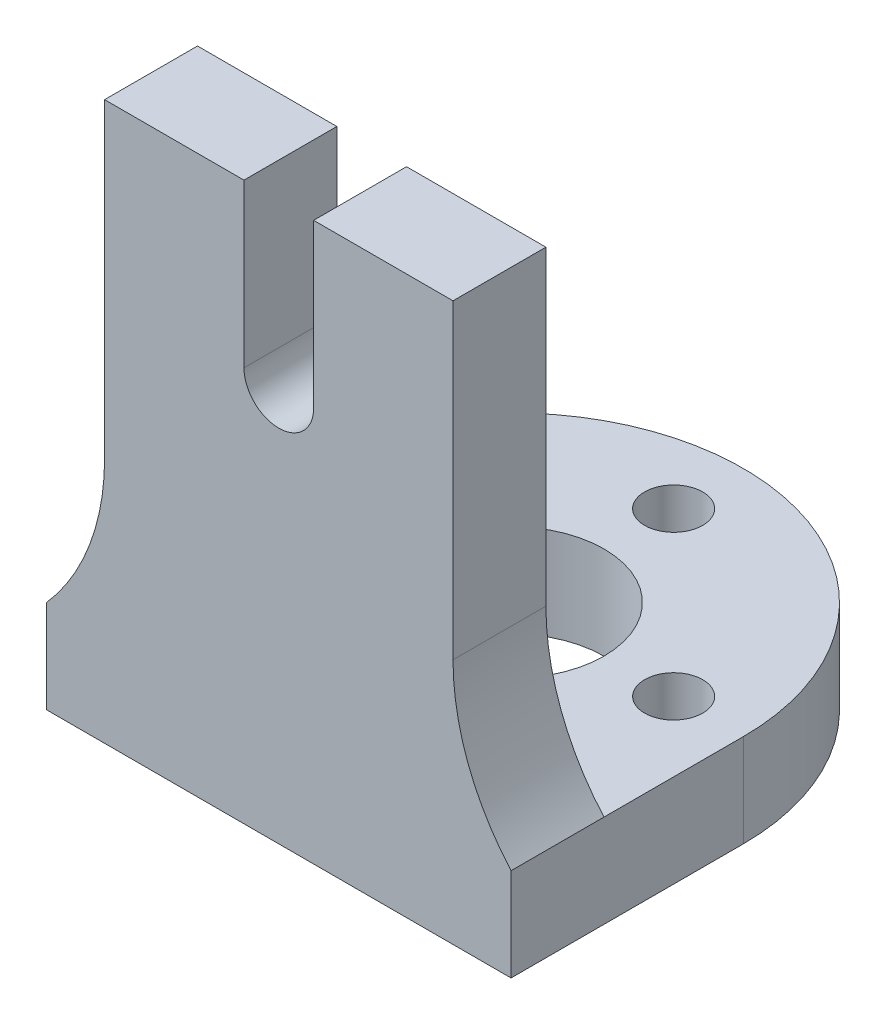
ISO-10303-21;
HEADER;
FILE_DESCRIPTION(('STEP AP214'),'2;1');
FILE_NAME('part.step','',(''),(''),'','','');
FILE_SCHEMA(('AUTOMOTIVE_DESIGN { 1 0 10303 214 1 1 1 1 }'));
ENDSEC;
DATA;
#1=APPLICATION_CONTEXT('core data for automotive mechanical design processes');
#2=APPLICATION_PROTOCOL_DEFINITION('international standard','automotive_design',2000,#1);
#3=PRODUCT_CONTEXT('',#1,'mechanical');
#4=PRODUCT('Part','Part','',(#3));
#5=PRODUCT_RELATED_PRODUCT_CATEGORY('part','',(#4));
#6=PRODUCT_DEFINITION_FORMATION('','',#4);
#7=PRODUCT_DEFINITION_CONTEXT('part definition',#1,'design');
#8=PRODUCT_DEFINITION('design','',#6,#7);
#9=PRODUCT_DEFINITION_SHAPE('','',#8);
#10=(LENGTH_UNIT() NAMED_UNIT(*) SI_UNIT(.MILLI.,.METRE.));
#11=(NAMED_UNIT(*) PLANE_ANGLE_UNIT() SI_UNIT($,.RADIAN.));
#12=(NAMED_UNIT(*) SI_UNIT($,.STERADIAN.) SOLID_ANGLE_UNIT());
#13=UNCERTAINTY_MEASURE_WITH_UNIT(LENGTH_MEASURE(1.E-05),#10,'distance_accuracy_value','');
#14=(GEOMETRIC_REPRESENTATION_CONTEXT(3) GLOBAL_UNCERTAINTY_ASSIGNED_CONTEXT((#13)) GLOBAL_UNIT_ASSIGNED_CONTEXT((#10,
#11,#12)) REPRESENTATION_CONTEXT('',''));
#15=CARTESIAN_POINT('',(0.,0.,0.));
#16=DIRECTION('',(0.,0.,1.));
#17=DIRECTION('',(1.,0.,0.));
#18=AXIS2_PLACEMENT_3D('',#15,#16,#17);
#19=CARTESIAN_POINT('',(0.,4.,10.));
#20=DIRECTION('',(0.,0.,-1.));
#21=DIRECTION('',(-1.,0.,0.));
#22=AXIS2_PLACEMENT_3D('',#19,#20,#21);
#23=PLANE('',#22);
#24=DIRECTION('',(0.,-1.,0.));
#25=VECTOR('',#24,1.);
#26=CARTESIAN_POINT('',(-7.5,0.,10.));
#27=LINE('',#26,#25);
#28=CARTESIAN_POINT('',(-7.5,24.,10.));
#29=VERTEX_POINT('',#28);
#30=CARTESIAN_POINT('',(-7.5,10.6143782776615,10.));
#31=VERTEX_POINT('',#30);
#32=EDGE_CURVE('E146',#29,#31,#27,.T.);
#33=ORIENTED_EDGE('',*,*,#32,.T.);
#34=CARTESIAN_POINT('',(-17.5,10.6143782776615,10.));
#35=DIRECTION('',(0.,0.,-1.));
#36=DIRECTION('',(-1.,0.,0.));
#37=AXIS2_PLACEMENT_3D('',#34,#35,#36);
#38=CIRCLE('',#37,10.);
#39=CARTESIAN_POINT('',(-10.,4.,10.));
#40=VERTEX_POINT('',#39);
#41=EDGE_CURVE('E11',#31,#40,#38,.T.);
#42=ORIENTED_EDGE('',*,*,#41,.T.);
#43=DIRECTION('',(0.,-1.,0.));
#44=VECTOR('',#43,1.);
#45=CARTESIAN_POINT('',(-10.,4.,10.));
#46=LINE('',#45,#44);
#47=CARTESIAN_POINT('',(-10.,0.,10.));
#48=VERTEX_POINT('',#47);
#49=EDGE_CURVE('E235',#40,#48,#46,.T.);
#50=ORIENTED_EDGE('',*,*,#49,.T.);
#51=DIRECTION('',(1.,0.,0.));
#52=VECTOR('',#51,1.);
#53=CARTESIAN_POINT('',(0.,0.,10.));
#54=LINE('',#53,#52);
#55=CARTESIAN_POINT('',(10.,0.,10.));
#56=VERTEX_POINT('',#55);
#57=EDGE_CURVE('E231',#48,#56,#54,.T.);
#58=ORIENTED_EDGE('',*,*,#57,.T.);
#59=DIRECTION('',(0.,-1.,0.));
#60=VECTOR('',#59,1.);
#61=CARTESIAN_POINT('',(10.,4.,10.));
#62=LINE('',#61,#60);
#63=CARTESIAN_POINT('',(10.,4.,10.));
#64=VERTEX_POINT('',#63);
#65=EDGE_CURVE('E223',#64,#56,#62,.T.);
#66=ORIENTED_EDGE('',*,*,#65,.F.);
#67=CARTESIAN_POINT('',(17.5,10.6143782776615,10.));
#68=DIRECTION('',(0.,0.,-1.));
#69=DIRECTION('',(-1.,0.,0.));
#70=AXIS2_PLACEMENT_3D('',#67,#68,#69);
#71=CIRCLE('',#70,10.);
#72=CARTESIAN_POINT('',(7.5,10.6143782776615,10.));
#73=VERTEX_POINT('',#72);
#74=EDGE_CURVE('E261',#64,#73,#71,.T.);
#75=ORIENTED_EDGE('',*,*,#74,.T.);
#76=DIRECTION('',(0.,-1.,0.));
#77=VECTOR('',#76,1.);
#78=CARTESIAN_POINT('',(7.49999999999999,0.,10.));
#79=LINE('',#78,#77);
#80=CARTESIAN_POINT('',(7.5,24.,10.));
#81=VERTEX_POINT('',#80);
#82=EDGE_CURVE('E267',#81,#73,#79,.T.);
#83=ORIENTED_EDGE('',*,*,#82,.F.);
#84=DIRECTION('',(1.,0.,0.));
#85=VECTOR('',#84,1.);
#86=CARTESIAN_POINT('',(-10.,24.,10.));
#87=LINE('',#86,#85);
#88=CARTESIAN_POINT('',(1.5,24.,10.));
#89=VERTEX_POINT('',#88);
#90=EDGE_CURVE('E168',#89,#81,#87,.T.);
#91=ORIENTED_EDGE('',*,*,#90,.F.);
#92=DIRECTION('',(0.,1.,0.));
#93=VECTOR('',#92,1.);
#94=CARTESIAN_POINT('',(1.5,4.,10.));
#95=LINE('',#94,#93);
#96=CARTESIAN_POINT('',(1.5,17.,10.));
#97=VERTEX_POINT('',#96);
#98=EDGE_CURVE('E307',#97,#89,#95,.T.);
#99=ORIENTED_EDGE('',*,*,#98,.F.);
#100=CARTESIAN_POINT('',(0.,17.,10.));
#101=DIRECTION('',(0.,0.,-1.));
#102=DIRECTION('',(-1.,0.,0.));
#103=AXIS2_PLACEMENT_3D('',#100,#101,#102);
#104=CIRCLE('',#103,1.5);
#105=CARTESIAN_POINT('',(-1.5,17.,10.));
#106=VERTEX_POINT('',#105);
#107=EDGE_CURVE('E175',#97,#106,#104,.T.);
#108=ORIENTED_EDGE('',*,*,#107,.T.);
#109=DIRECTION('',(0.,-1.,0.));
#110=VECTOR('',#109,1.);
#111=CARTESIAN_POINT('',(-1.5,4.,10.));
#112=LINE('',#111,#110);
#113=CARTESIAN_POINT('',(-1.5,24.,10.));
#114=VERTEX_POINT('',#113);
#115=EDGE_CURVE('E167',#114,#106,#112,.T.);
#116=ORIENTED_EDGE('',*,*,#115,.F.);
#117=EDGE_CURVE('E159',#29,#114,#87,.T.);
#118=ORIENTED_EDGE('',*,*,#117,.F.);
#119=EDGE_LOOP('',(#33,#42,#50,#58,#66,#75,#83,#91,#99,#108,#116,#118));
#120=FACE_BOUND('',#119,.T.);
#121=ADVANCED_FACE('F37',(#120),#23,.F.);
#122=CARTESIAN_POINT('',(-10.,24.,6.));
#123=DIRECTION('',(0.,0.,1.));
#124=DIRECTION('',(1.,0.,0.));
#125=AXIS2_PLACEMENT_3D('',#122,#123,#124);
#126=PLANE('',#125);
#127=DIRECTION('',(-1.,0.,0.));
#128=VECTOR('',#127,1.);
#129=CARTESIAN_POINT('',(-10.,4.,6.));
#130=LINE('',#129,#128);
#131=CARTESIAN_POINT('',(-0.750000000000001,4.,6.));
#132=VERTEX_POINT('',#131);
#133=CARTESIAN_POINT('',(-10.,4.,6.));
#134=VERTEX_POINT('',#133);
#135=EDGE_CURVE('E181',#132,#134,#130,.T.);
#136=ORIENTED_EDGE('',*,*,#135,.T.);
#137=CARTESIAN_POINT('',(-17.5,10.6143782776615,6.));
#138=DIRECTION('',(0.,0.,1.));
#139=DIRECTION('',(1.,0.,0.));
#140=AXIS2_PLACEMENT_3D('',#137,#138,#139);
#141=CIRCLE('',#140,10.);
#142=CARTESIAN_POINT('',(-7.5,10.6143782776615,6.));
#143=VERTEX_POINT('',#142);
#144=EDGE_CURVE('E45',#134,#143,#141,.T.);
#145=ORIENTED_EDGE('',*,*,#144,.T.);
#146=DIRECTION('',(0.,-1.,0.));
#147=VECTOR('',#146,1.);
#148=CARTESIAN_POINT('',(-7.5,0.,6.));
#149=LINE('',#148,#147);
#150=CARTESIAN_POINT('',(-7.5,24.,6.));
#151=VERTEX_POINT('',#150);
#152=EDGE_CURVE('E153',#151,#143,#149,.T.);
#153=ORIENTED_EDGE('',*,*,#152,.F.);
#154=DIRECTION('',(-1.,0.,0.));
#155=VECTOR('',#154,1.);
#156=CARTESIAN_POINT('',(-10.,24.,6.));
#157=LINE('',#156,#155);
#158=CARTESIAN_POINT('',(-1.5,24.,6.));
#159=VERTEX_POINT('',#158);
#160=EDGE_CURVE('E162',#159,#151,#157,.T.);
#161=ORIENTED_EDGE('',*,*,#160,.F.);
#162=DIRECTION('',(0.,-1.,0.));
#163=VECTOR('',#162,1.);
#164=CARTESIAN_POINT('',(-1.5,0.,6.));
#165=LINE('',#164,#163);
#166=CARTESIAN_POINT('',(-1.5,19.8831406486677,6.));
#167=VERTEX_POINT('',#166);
#168=EDGE_CURVE('E318',#159,#167,#165,.T.);
#169=ORIENTED_EDGE('',*,*,#168,.T.);
#170=CARTESIAN_POINT('',(0.,17.,6.));
#171=DIRECTION('',(0.,0.,-1.));
#172=DIRECTION('',(-1.,0.,0.));
#173=AXIS2_PLACEMENT_3D('',#170,#171,#172);
#174=CIRCLE('',#173,3.25);
#175=CARTESIAN_POINT('',(1.5,19.8831406486677,6.));
#176=VERTEX_POINT('',#175);
#177=EDGE_CURVE('E163',#176,#167,#174,.T.);
#178=ORIENTED_EDGE('',*,*,#177,.F.);
#179=DIRECTION('',(0.,1.,0.));
#180=VECTOR('',#179,1.);
#181=CARTESIAN_POINT('',(1.5,0.,6.));
#182=LINE('',#181,#180);
#183=CARTESIAN_POINT('',(1.5,24.,6.));
#184=VERTEX_POINT('',#183);
#185=EDGE_CURVE('E323',#176,#184,#182,.T.);
#186=ORIENTED_EDGE('',*,*,#185,.T.);
#187=CARTESIAN_POINT('',(7.5,24.,6.));
#188=VERTEX_POINT('',#187);
#189=EDGE_CURVE('E170',#188,#184,#157,.T.);
#190=ORIENTED_EDGE('',*,*,#189,.F.);
#191=DIRECTION('',(0.,-1.,0.));
#192=VECTOR('',#191,1.);
#193=CARTESIAN_POINT('',(7.49999999999999,0.,6.));
#194=LINE('',#193,#192);
#195=CARTESIAN_POINT('',(7.5,10.6143782776615,6.));
#196=VERTEX_POINT('',#195);
#197=EDGE_CURVE('E275',#188,#196,#194,.T.);
#198=ORIENTED_EDGE('',*,*,#197,.T.);
#199=CARTESIAN_POINT('',(17.5,10.6143782776615,6.));
#200=DIRECTION('',(0.,0.,1.));
#201=DIRECTION('',(1.,0.,0.));
#202=AXIS2_PLACEMENT_3D('',#199,#200,#201);
#203=CIRCLE('',#202,10.);
#204=CARTESIAN_POINT('',(10.,4.,6.));
#205=VERTEX_POINT('',#204);
#206=EDGE_CURVE('E258',#196,#205,#203,.T.);
#207=ORIENTED_EDGE('',*,*,#206,.T.);
#208=CARTESIAN_POINT('',(0.750000000000002,4.,6.));
#209=VERTEX_POINT('',#208);
#210=EDGE_CURVE('E173',#205,#209,#130,.T.);
#211=ORIENTED_EDGE('',*,*,#210,.T.);
#212=EDGE_CURVE('E180',#209,#132,#130,.T.);
#213=ORIENTED_EDGE('',*,*,#212,.T.);
#214=EDGE_LOOP('',(#136,#145,#153,#161,#169,#178,#186,#190,#198,#207,#211,#213));
#215=FACE_BOUND('',#214,.T.);
#216=ADVANCED_FACE('F279',(#215),#126,.F.);
#217=CARTESIAN_POINT('',(0.,24.,0.));
#218=DIRECTION('',(0.,-1.,0.));
#219=DIRECTION('',(0.,0.,-1.));
#220=AXIS2_PLACEMENT_3D('',#217,#218,#219);
#221=PLANE('',#220);
#222=DIRECTION('',(0.,0.,-1.));
#223=VECTOR('',#222,1.);
#224=CARTESIAN_POINT('',(7.5,24.,10.));
#225=LINE('',#224,#223);
#226=EDGE_CURVE('E274',#81,#188,#225,.T.);
#227=ORIENTED_EDGE('',*,*,#226,.T.);
#228=ORIENTED_EDGE('',*,*,#189,.T.);
#229=DIRECTION('',(0.,0.,-1.));
#230=VECTOR('',#229,1.);
#231=CARTESIAN_POINT('',(1.5,24.,0.));
#232=LINE('',#231,#230);
#233=EDGE_CURVE('E245',#89,#184,#232,.T.);
#234=ORIENTED_EDGE('',*,*,#233,.F.);
#235=ORIENTED_EDGE('',*,*,#90,.T.);
#236=EDGE_LOOP('',(#227,#228,#234,#235));
#237=FACE_BOUND('',#236,.T.);
#238=ADVANCED_FACE('F361',(#237),#221,.F.);
#239=CARTESIAN_POINT('',(0.,17.,36.));
#240=DIRECTION('',(0.,0.,-1.));
#241=DIRECTION('',(-1.,0.,0.));
#242=AXIS2_PLACEMENT_3D('',#239,#240,#241);
#243=CYLINDRICAL_SURFACE('',#242,1.5);
#244=CARTESIAN_POINT('',(0.,17.,7.));
#245=DIRECTION('',(0.,0.,-1.));
#246=DIRECTION('',(-1.,0.,0.));
#247=AXIS2_PLACEMENT_3D('',#244,#245,#246);
#248=CIRCLE('',#247,1.5);
#249=CARTESIAN_POINT('',(-1.5,17.,7.));
#250=VERTEX_POINT('',#249);
#251=CARTESIAN_POINT('',(1.5,17.,7.));
#252=VERTEX_POINT('',#251);
#253=EDGE_CURVE('E331',#250,#252,#248,.F.);
#254=ORIENTED_EDGE('',*,*,#253,.F.);
#255=DIRECTION('',(0.,0.,-1.));
#256=VECTOR('',#255,1.);
#257=CARTESIAN_POINT('',(-1.5,17.,36.));
#258=LINE('',#257,#256);
#259=EDGE_CURVE('E312',#106,#250,#258,.T.);
#260=ORIENTED_EDGE('',*,*,#259,.F.);
#261=ORIENTED_EDGE('',*,*,#107,.F.);
#262=DIRECTION('',(0.,0.,-1.));
#263=VECTOR('',#262,1.);
#264=CARTESIAN_POINT('',(1.5,17.,36.));
#265=LINE('',#264,#263);
#266=EDGE_CURVE('E315',#97,#252,#265,.T.);
#267=ORIENTED_EDGE('',*,*,#266,.T.);
#268=EDGE_LOOP('',(#254,#260,#261,#267));
#269=FACE_BOUND('',#268,.T.);
#270=ADVANCED_FACE('F393',(#269),#243,.F.);
#271=ORIENTED_EDGE('',*,*,#160,.T.);
#272=DIRECTION('',(0.,0.,-1.));
#273=VECTOR('',#272,1.);
#274=CARTESIAN_POINT('',(-7.5,24.,10.));
#275=LINE('',#274,#273);
#276=EDGE_CURVE('E149',#29,#151,#275,.T.);
#277=ORIENTED_EDGE('',*,*,#276,.F.);
#278=ORIENTED_EDGE('',*,*,#117,.T.);
#279=DIRECTION('',(0.,0.,1.));
#280=VECTOR('',#279,1.);
#281=CARTESIAN_POINT('',(-1.5,24.,0.));
#282=LINE('',#281,#280);
#283=EDGE_CURVE('E243',#159,#114,#282,.T.);
#284=ORIENTED_EDGE('',*,*,#283,.F.);
#285=EDGE_LOOP('',(#271,#277,#278,#284));
#286=FACE_BOUND('',#285,.T.);
#287=ADVANCED_FACE('F157',(#286),#221,.F.);
#288=CARTESIAN_POINT('',(10.,4.,0.));
#289=DIRECTION('',(-1.,0.,0.));
#290=DIRECTION('',(0.,0.,1.));
#291=AXIS2_PLACEMENT_3D('',#288,#289,#290);
#292=PLANE('',#291);
#293=DIRECTION('',(0.,0.,-1.));
#294=VECTOR('',#293,1.);
#295=CARTESIAN_POINT('',(10.,4.,0.));
#296=LINE('',#295,#294);
#297=EDGE_CURVE('E213',#64,#205,#296,.T.);
#298=ORIENTED_EDGE('',*,*,#297,.F.);
#299=ORIENTED_EDGE('',*,*,#65,.T.);
#300=DIRECTION('',(0.,0.,-1.));
#301=VECTOR('',#300,1.);
#302=CARTESIAN_POINT('',(10.,0.,0.));
#303=LINE('',#302,#301);
#304=CARTESIAN_POINT('',(10.,0.,0.));
#305=VERTEX_POINT('',#304);
#306=EDGE_CURVE('E210',#56,#305,#303,.T.);
#307=ORIENTED_EDGE('',*,*,#306,.T.);
#308=DIRECTION('',(0.,-1.,0.));
#309=VECTOR('',#308,1.);
#310=CARTESIAN_POINT('',(10.,4.,0.));
#311=LINE('',#310,#309);
#312=CARTESIAN_POINT('',(10.,4.,0.));
#313=VERTEX_POINT('',#312);
#314=EDGE_CURVE('E240',#313,#305,#311,.T.);
#315=ORIENTED_EDGE('',*,*,#314,.F.);
#316=EDGE_CURVE('E217',#205,#313,#296,.T.);
#317=ORIENTED_EDGE('',*,*,#316,.F.);
#318=EDGE_LOOP('',(#298,#299,#307,#315,#317));
#319=FACE_BOUND('',#318,.T.);
#320=ADVANCED_FACE('F285',(#319),#292,.F.);
#321=CARTESIAN_POINT('',(0.,4.,0.));
#322=DIRECTION('',(0.,-1.,0.));
#323=DIRECTION('',(0.,0.,-1.));
#324=AXIS2_PLACEMENT_3D('',#321,#322,#323);
#325=CYLINDRICAL_SURFACE('',#324,10.);
#326=CARTESIAN_POINT('',(0.,0.,0.));
#327=DIRECTION('',(0.,1.,0.));
#328=DIRECTION('',(0.,0.,1.));
#329=AXIS2_PLACEMENT_3D('',#326,#327,#328);
#330=CIRCLE('',#329,10.);
#331=CARTESIAN_POINT('',(-10.,0.,0.));
#332=VERTEX_POINT('',#331);
#333=EDGE_CURVE('E226',#305,#332,#330,.T.);
#334=ORIENTED_EDGE('',*,*,#333,.T.);
#335=DIRECTION('',(0.,-1.,0.));
#336=VECTOR('',#335,1.);
#337=CARTESIAN_POINT('',(-10.,4.,0.));
#338=LINE('',#337,#336);
#339=CARTESIAN_POINT('',(-10.,4.,0.));
#340=VERTEX_POINT('',#339);
#341=EDGE_CURVE('E237',#340,#332,#338,.T.);
#342=ORIENTED_EDGE('',*,*,#341,.F.);
#343=CARTESIAN_POINT('',(0.,4.,0.));
#344=DIRECTION('',(0.,1.,0.));
#345=DIRECTION('',(0.,0.,1.));
#346=AXIS2_PLACEMENT_3D('',#343,#344,#345);
#347=CIRCLE('',#346,10.);
#348=EDGE_CURVE('E216',#313,#340,#347,.T.);
#349=ORIENTED_EDGE('',*,*,#348,.F.);
#350=ORIENTED_EDGE('',*,*,#314,.T.);
#351=EDGE_LOOP('',(#334,#342,#349,#350));
#352=FACE_BOUND('',#351,.T.);
#353=ADVANCED_FACE('F293',(#352),#325,.T.);
#354=CARTESIAN_POINT('',(-10.,4.,0.));
#355=DIRECTION('',(1.,0.,0.));
#356=DIRECTION('',(0.,0.,-1.));
#357=AXIS2_PLACEMENT_3D('',#354,#355,#356);
#358=PLANE('',#357);
#359=ORIENTED_EDGE('',*,*,#49,.F.);
#360=DIRECTION('',(0.,0.,1.));
#361=VECTOR('',#360,1.);
#362=CARTESIAN_POINT('',(-10.,4.,0.));
#363=LINE('',#362,#361);
#364=EDGE_CURVE('E219',#134,#40,#363,.T.);
#365=ORIENTED_EDGE('',*,*,#364,.F.);
#366=EDGE_CURVE('E220',#340,#134,#363,.T.);
#367=ORIENTED_EDGE('',*,*,#366,.F.);
#368=ORIENTED_EDGE('',*,*,#341,.T.);
#369=DIRECTION('',(0.,0.,1.));
#370=VECTOR('',#369,1.);
#371=CARTESIAN_POINT('',(-10.,0.,0.));
#372=LINE('',#371,#370);
#373=EDGE_CURVE('E228',#332,#48,#372,.T.);
#374=ORIENTED_EDGE('',*,*,#373,.T.);
#375=EDGE_LOOP('',(#359,#365,#367,#368,#374));
#376=FACE_BOUND('',#375,.T.);
#377=ADVANCED_FACE('F299',(#376),#358,.F.);
#378=CARTESIAN_POINT('',(0.,4.,0.));
#379=DIRECTION('',(0.,1.,0.));
#380=DIRECTION('',(0.,0.,1.));
#381=AXIS2_PLACEMENT_3D('',#378,#379,#380);
#382=PLANE('',#381);
#383=ORIENTED_EDGE('',*,*,#210,.F.);
#384=ORIENTED_EDGE('',*,*,#316,.T.);
#385=ORIENTED_EDGE('',*,*,#348,.T.);
#386=ORIENTED_EDGE('',*,*,#366,.T.);
#387=ORIENTED_EDGE('',*,*,#135,.F.);
#388=CARTESIAN_POINT('',(0.,4.,7.));
#389=DIRECTION('',(0.,1.,0.));
#390=DIRECTION('',(0.,0.,1.));
#391=AXIS2_PLACEMENT_3D('',#388,#389,#390);
#392=CIRCLE('',#391,1.25);
#393=EDGE_CURVE('E186',#209,#132,#392,.T.);
#394=ORIENTED_EDGE('',*,*,#393,.F.);
#395=EDGE_LOOP('',(#383,#384,#385,#386,#387,#394));
#396=FACE_BOUND('',#395,.T.);
#397=CARTESIAN_POINT('',(0.,4.,-7.));
#398=DIRECTION('',(0.,1.,0.));
#399=DIRECTION('',(0.,0.,1.));
#400=AXIS2_PLACEMENT_3D('',#397,#398,#399);
#401=CIRCLE('',#400,1.25);
#402=CARTESIAN_POINT('',(0.,4.,-5.75));
#403=VERTEX_POINT('',#402);
#404=EDGE_CURVE('E199',#403,#403,#401,.T.);
#405=ORIENTED_EDGE('',*,*,#404,.F.);
#406=EDGE_LOOP('',(#405));
#407=FACE_BOUND('',#406,.T.);
#408=CARTESIAN_POINT('',(7.,4.,0.));
#409=DIRECTION('',(0.,1.,0.));
#410=DIRECTION('',(0.,0.,1.));
#411=AXIS2_PLACEMENT_3D('',#408,#409,#410);
#412=CIRCLE('',#411,1.25);
#413=CARTESIAN_POINT('',(7.,4.,1.25));
#414=VERTEX_POINT('',#413);
#415=EDGE_CURVE('E185',#414,#414,#412,.T.);
#416=ORIENTED_EDGE('',*,*,#415,.F.);
#417=EDGE_LOOP('',(#416));
#418=FACE_BOUND('',#417,.T.);
#419=CARTESIAN_POINT('',(-7.,4.,0.));
#420=DIRECTION('',(0.,1.,0.));
#421=DIRECTION('',(0.,0.,1.));
#422=AXIS2_PLACEMENT_3D('',#419,#420,#421);
#423=CIRCLE('',#422,1.25);
#424=CARTESIAN_POINT('',(-7.,4.,1.25));
#425=VERTEX_POINT('',#424);
#426=EDGE_CURVE('E178',#425,#425,#423,.T.);
#427=ORIENTED_EDGE('',*,*,#426,.F.);
#428=EDGE_LOOP('',(#427));
#429=FACE_BOUND('',#428,.T.);
#430=CARTESIAN_POINT('',(0.,4.,0.));
#431=DIRECTION('',(0.,1.,0.));
#432=DIRECTION('',(0.,0.,1.));
#433=AXIS2_PLACEMENT_3D('',#430,#431,#432);
#434=CIRCLE('',#433,4.);
#435=CARTESIAN_POINT('',(0.,4.,4.));
#436=VERTEX_POINT('',#435);
#437=EDGE_CURVE('E198',#436,#436,#434,.T.);
#438=ORIENTED_EDGE('',*,*,#437,.F.);
#439=EDGE_LOOP('',(#438));
#440=FACE_BOUND('',#439,.T.);
#441=ADVANCED_FACE('F288',(#396,#407,#418,#429,#440),#382,.T.);
#442=CARTESIAN_POINT('',(0.,0.,0.));
#443=DIRECTION('',(0.,1.,0.));
#444=DIRECTION('',(0.,0.,1.));
#445=AXIS2_PLACEMENT_3D('',#442,#443,#444);
#446=PLANE('',#445);
#447=CARTESIAN_POINT('',(0.,0.,-7.));
#448=DIRECTION('',(0.,1.,0.));
#449=DIRECTION('',(0.,0.,1.));
#450=AXIS2_PLACEMENT_3D('',#447,#448,#449);
#451=CIRCLE('',#450,1.25);
#452=CARTESIAN_POINT('',(0.,0.,-5.75));
#453=VERTEX_POINT('',#452);
#454=EDGE_CURVE('E195',#453,#453,#451,.T.);
#455=ORIENTED_EDGE('',*,*,#454,.T.);
#456=EDGE_LOOP('',(#455));
#457=FACE_BOUND('',#456,.T.);
#458=CARTESIAN_POINT('',(7.,0.,0.));
#459=DIRECTION('',(0.,1.,0.));
#460=DIRECTION('',(0.,0.,1.));
#461=AXIS2_PLACEMENT_3D('',#458,#459,#460);
#462=CIRCLE('',#461,1.25);
#463=CARTESIAN_POINT('',(7.,0.,1.25));
#464=VERTEX_POINT('',#463);
#465=EDGE_CURVE('E202',#464,#464,#462,.T.);
#466=ORIENTED_EDGE('',*,*,#465,.T.);
#467=EDGE_LOOP('',(#466));
#468=FACE_BOUND('',#467,.T.);
#469=CARTESIAN_POINT('',(0.,0.,7.));
#470=DIRECTION('',(0.,1.,0.));
#471=DIRECTION('',(0.,0.,1.));
#472=AXIS2_PLACEMENT_3D('',#469,#470,#471);
#473=CIRCLE('',#472,1.25);
#474=CARTESIAN_POINT('',(0.,0.,8.25));
#475=VERTEX_POINT('',#474);
#476=EDGE_CURVE('E182',#475,#475,#473,.T.);
#477=ORIENTED_EDGE('',*,*,#476,.T.);
#478=EDGE_LOOP('',(#477));
#479=FACE_BOUND('',#478,.T.);
#480=CARTESIAN_POINT('',(-7.,0.,0.));
#481=DIRECTION('',(0.,1.,0.));
#482=DIRECTION('',(0.,0.,1.));
#483=AXIS2_PLACEMENT_3D('',#480,#481,#482);
#484=CIRCLE('',#483,1.25);
#485=CARTESIAN_POINT('',(-7.,0.,1.25));
#486=VERTEX_POINT('',#485);
#487=EDGE_CURVE('E190',#486,#486,#484,.T.);
#488=ORIENTED_EDGE('',*,*,#487,.T.);
#489=EDGE_LOOP('',(#488));
#490=FACE_BOUND('',#489,.T.);
#491=CARTESIAN_POINT('',(0.,0.,0.));
#492=DIRECTION('',(0.,1.,0.));
#493=DIRECTION('',(0.,0.,1.));
#494=AXIS2_PLACEMENT_3D('',#491,#492,#493);
#495=CIRCLE('',#494,4.);
#496=CARTESIAN_POINT('',(0.,0.,4.));
#497=VERTEX_POINT('',#496);
#498=EDGE_CURVE('E207',#497,#497,#495,.T.);
#499=ORIENTED_EDGE('',*,*,#498,.T.);
#500=EDGE_LOOP('',(#499));
#501=FACE_BOUND('',#500,.T.);
#502=ORIENTED_EDGE('',*,*,#306,.F.);
#503=ORIENTED_EDGE('',*,*,#57,.F.);
#504=ORIENTED_EDGE('',*,*,#373,.F.);
#505=ORIENTED_EDGE('',*,*,#333,.F.);
#506=EDGE_LOOP('',(#502,#503,#504,#505));
#507=FACE_BOUND('',#506,.T.);
#508=ADVANCED_FACE('F342',(#457,#468,#479,#490,#501,#507),#446,.F.);
#509=CARTESIAN_POINT('',(0.,0.,0.));
#510=DIRECTION('',(0.,1.,0.));
#511=DIRECTION('',(0.,0.,1.));
#512=AXIS2_PLACEMENT_3D('',#509,#510,#511);
#513=CYLINDRICAL_SURFACE('',#512,4.);
#514=ORIENTED_EDGE('',*,*,#498,.F.);
#515=EDGE_LOOP('',(#514));
#516=FACE_BOUND('',#515,.T.);
#517=ORIENTED_EDGE('',*,*,#437,.T.);
#518=EDGE_LOOP('',(#517));
#519=FACE_BOUND('',#518,.T.);
#520=ADVANCED_FACE('F344',(#516,#519),#513,.F.);
#521=CARTESIAN_POINT('',(-7.,0.,0.));
#522=DIRECTION('',(0.,1.,0.));
#523=DIRECTION('',(0.,0.,1.));
#524=AXIS2_PLACEMENT_3D('',#521,#522,#523);
#525=CYLINDRICAL_SURFACE('',#524,1.25);
#526=ORIENTED_EDGE('',*,*,#487,.F.);
#527=EDGE_LOOP('',(#526));
#528=FACE_BOUND('',#527,.T.);
#529=ORIENTED_EDGE('',*,*,#426,.T.);
#530=EDGE_LOOP('',(#529));
#531=FACE_BOUND('',#530,.T.);
#532=ADVANCED_FACE('F351',(#528,#531),#525,.F.);
#533=CARTESIAN_POINT('',(0.,0.,7.));
#534=DIRECTION('',(0.,1.,0.));
#535=DIRECTION('',(0.,0.,1.));
#536=AXIS2_PLACEMENT_3D('',#533,#534,#535);
#537=CYLINDRICAL_SURFACE('',#536,1.25);
#538=ORIENTED_EDGE('',*,*,#476,.F.);
#539=EDGE_LOOP('',(#538));
#540=FACE_BOUND('',#539,.T.);
#541=ORIENTED_EDGE('',*,*,#393,.T.);
#542=EDGE_CURVE('E189',#132,#209,#392,.T.);
#543=ORIENTED_EDGE('',*,*,#542,.T.);
#544=EDGE_LOOP('',(#541,#543));
#545=FACE_BOUND('',#544,.T.);
#546=ADVANCED_FACE('F304',(#540,#545),#537,.F.);
#547=CARTESIAN_POINT('',(7.,0.,0.));
#548=DIRECTION('',(0.,1.,0.));
#549=DIRECTION('',(0.,0.,1.));
#550=AXIS2_PLACEMENT_3D('',#547,#548,#549);
#551=CYLINDRICAL_SURFACE('',#550,1.25);
#552=ORIENTED_EDGE('',*,*,#465,.F.);
#553=EDGE_LOOP('',(#552));
#554=FACE_BOUND('',#553,.T.);
#555=ORIENTED_EDGE('',*,*,#415,.T.);
#556=EDGE_LOOP('',(#555));
#557=FACE_BOUND('',#556,.T.);
#558=ADVANCED_FACE('F407',(#554,#557),#551,.F.);
#559=CARTESIAN_POINT('',(0.,0.,-7.));
#560=DIRECTION('',(0.,1.,0.));
#561=DIRECTION('',(0.,0.,1.));
#562=AXIS2_PLACEMENT_3D('',#559,#560,#561);
#563=CYLINDRICAL_SURFACE('',#562,1.25);
#564=ORIENTED_EDGE('',*,*,#454,.F.);
#565=EDGE_LOOP('',(#564));
#566=FACE_BOUND('',#565,.T.);
#567=ORIENTED_EDGE('',*,*,#404,.T.);
#568=EDGE_LOOP('',(#567));
#569=FACE_BOUND('',#568,.T.);
#570=ADVANCED_FACE('F403',(#566,#569),#563,.F.);
#571=CARTESIAN_POINT('',(0.,4.,0.));
#572=DIRECTION('',(0.,-1.,0.));
#573=DIRECTION('',(0.,0.,-1.));
#574=AXIS2_PLACEMENT_3D('',#571,#572,#573);
#575=PLANE('',#574);
#576=ORIENTED_EDGE('',*,*,#542,.F.);
#577=ORIENTED_EDGE('',*,*,#212,.F.);
#578=EDGE_LOOP('',(#576,#577));
#579=FACE_BOUND('',#578,.T.);
#580=ADVANCED_FACE('F306',(#579),#575,.T.);
#581=CARTESIAN_POINT('',(1.5,0.,36.));
#582=DIRECTION('',(-1.,0.,0.));
#583=DIRECTION('',(0.,0.,1.));
#584=AXIS2_PLACEMENT_3D('',#581,#582,#583);
#585=PLANE('',#584);
#586=DIRECTION('',(0.,0.,-1.));
#587=VECTOR('',#586,1.);
#588=CARTESIAN_POINT('',(1.5,19.8831406486677,7.));
#589=LINE('',#588,#587);
#590=CARTESIAN_POINT('',(1.5,19.8831406486677,7.));
#591=VERTEX_POINT('',#590);
#592=EDGE_CURVE('E326',#591,#176,#589,.T.);
#593=ORIENTED_EDGE('',*,*,#592,.F.);
#594=DIRECTION('',(0.,-1.,0.));
#595=VECTOR('',#594,1.);
#596=CARTESIAN_POINT('',(1.5,0.,7.));
#597=LINE('',#596,#595);
#598=EDGE_CURVE('E328',#591,#252,#597,.T.);
#599=ORIENTED_EDGE('',*,*,#598,.T.);
#600=ORIENTED_EDGE('',*,*,#266,.F.);
#601=ORIENTED_EDGE('',*,*,#98,.T.);
#602=ORIENTED_EDGE('',*,*,#233,.T.);
#603=ORIENTED_EDGE('',*,*,#185,.F.);
#604=EDGE_LOOP('',(#593,#599,#600,#601,#602,#603));
#605=FACE_BOUND('',#604,.T.);
#606=ADVANCED_FACE('F391',(#605),#585,.T.);
#607=CARTESIAN_POINT('',(-1.5,0.,36.));
#608=DIRECTION('',(1.,0.,0.));
#609=DIRECTION('',(0.,0.,-1.));
#610=AXIS2_PLACEMENT_3D('',#607,#608,#609);
#611=PLANE('',#610);
#612=DIRECTION('',(0.,0.,-1.));
#613=VECTOR('',#612,1.);
#614=CARTESIAN_POINT('',(-1.5,19.8831406486677,7.));
#615=LINE('',#614,#613);
#616=CARTESIAN_POINT('',(-1.5,19.8831406486677,7.));
#617=VERTEX_POINT('',#616);
#618=EDGE_CURVE('E251',#167,#617,#615,.F.);
#619=ORIENTED_EDGE('',*,*,#618,.F.);
#620=ORIENTED_EDGE('',*,*,#168,.F.);
#621=ORIENTED_EDGE('',*,*,#283,.T.);
#622=ORIENTED_EDGE('',*,*,#115,.T.);
#623=ORIENTED_EDGE('',*,*,#259,.T.);
#624=DIRECTION('',(0.,1.,0.));
#625=VECTOR('',#624,1.);
#626=CARTESIAN_POINT('',(-1.5,0.,7.));
#627=LINE('',#626,#625);
#628=EDGE_CURVE('E248',#250,#617,#627,.T.);
#629=ORIENTED_EDGE('',*,*,#628,.T.);
#630=EDGE_LOOP('',(#619,#620,#621,#622,#623,#629));
#631=FACE_BOUND('',#630,.T.);
#632=ADVANCED_FACE('F387',(#631),#611,.T.);
#633=CARTESIAN_POINT('',(0.,17.,7.));
#634=DIRECTION('',(0.,0.,-1.));
#635=DIRECTION('',(-1.,0.,0.));
#636=AXIS2_PLACEMENT_3D('',#633,#634,#635);
#637=CYLINDRICAL_SURFACE('',#636,3.25);
#638=ORIENTED_EDGE('',*,*,#592,.T.);
#639=ORIENTED_EDGE('',*,*,#177,.T.);
#640=ORIENTED_EDGE('',*,*,#618,.T.);
#641=CARTESIAN_POINT('',(0.,17.,7.));
#642=DIRECTION('',(0.,0.,-1.));
#643=DIRECTION('',(-1.,0.,0.));
#644=AXIS2_PLACEMENT_3D('',#641,#642,#643);
#645=CIRCLE('',#644,3.25);
#646=EDGE_CURVE('E333',#591,#617,#645,.T.);
#647=ORIENTED_EDGE('',*,*,#646,.F.);
#648=EDGE_LOOP('',(#638,#639,#640,#647));
#649=FACE_BOUND('',#648,.T.);
#650=ADVANCED_FACE('F383',(#649),#637,.F.);
#651=CARTESIAN_POINT('',(0.,17.,7.));
#652=DIRECTION('',(0.,0.,-1.));
#653=DIRECTION('',(-1.,0.,0.));
#654=AXIS2_PLACEMENT_3D('',#651,#652,#653);
#655=PLANE('',#654);
#656=ORIENTED_EDGE('',*,*,#646,.T.);
#657=ORIENTED_EDGE('',*,*,#628,.F.);
#658=ORIENTED_EDGE('',*,*,#253,.T.);
#659=ORIENTED_EDGE('',*,*,#598,.F.);
#660=EDGE_LOOP('',(#656,#657,#658,#659));
#661=FACE_BOUND('',#660,.T.);
#662=ADVANCED_FACE('F378',(#661),#655,.T.);
#663=CARTESIAN_POINT('',(7.49999999999999,0.,10.));
#664=DIRECTION('',(1.,0.,0.));
#665=DIRECTION('',(0.,1.,0.));
#666=AXIS2_PLACEMENT_3D('',#663,#664,#665);
#667=PLANE('',#666);
#668=ORIENTED_EDGE('',*,*,#82,.T.);
#669=DIRECTION('',(0.,0.,-1.));
#670=VECTOR('',#669,1.);
#671=CARTESIAN_POINT('',(7.5,10.6143782776615,6.));
#672=LINE('',#671,#670);
#673=EDGE_CURVE('E254',#73,#196,#672,.T.);
#674=ORIENTED_EDGE('',*,*,#673,.T.);
#675=ORIENTED_EDGE('',*,*,#197,.F.);
#676=ORIENTED_EDGE('',*,*,#226,.F.);
#677=EDGE_LOOP('',(#668,#674,#675,#676));
#678=FACE_BOUND('',#677,.T.);
#679=ADVANCED_FACE('F271',(#678),#667,.T.);
#680=CARTESIAN_POINT('',(-7.5,0.,10.));
#681=DIRECTION('',(1.,0.,0.));
#682=DIRECTION('',(0.,0.,-1.));
#683=AXIS2_PLACEMENT_3D('',#680,#681,#682);
#684=PLANE('',#683);
#685=ORIENTED_EDGE('',*,*,#152,.T.);
#686=DIRECTION('',(0.,0.,-1.));
#687=VECTOR('',#686,1.);
#688=CARTESIAN_POINT('',(-7.5,10.6143782776615,10.));
#689=LINE('',#688,#687);
#690=EDGE_CURVE('E52',#143,#31,#689,.F.);
#691=ORIENTED_EDGE('',*,*,#690,.T.);
#692=ORIENTED_EDGE('',*,*,#32,.F.);
#693=ORIENTED_EDGE('',*,*,#276,.T.);
#694=EDGE_LOOP('',(#685,#691,#692,#693));
#695=FACE_BOUND('',#694,.T.);
#696=ADVANCED_FACE('F148',(#695),#684,.F.);
#697=CARTESIAN_POINT('',(17.5,10.6143782776615,0.));
#698=DIRECTION('',(0.,0.,1.));
#699=DIRECTION('',(1.,0.,0.));
#700=AXIS2_PLACEMENT_3D('',#697,#698,#699);
#701=CYLINDRICAL_SURFACE('',#700,10.);
#702=ORIENTED_EDGE('',*,*,#74,.F.);
#703=ORIENTED_EDGE('',*,*,#297,.T.);
#704=ORIENTED_EDGE('',*,*,#206,.F.);
#705=ORIENTED_EDGE('',*,*,#673,.F.);
#706=EDGE_LOOP('',(#702,#703,#704,#705));
#707=FACE_BOUND('',#706,.T.);
#708=ADVANCED_FACE('F277',(#707),#701,.F.);
#709=CARTESIAN_POINT('',(-17.5,10.6143782776615,0.));
#710=DIRECTION('',(0.,0.,-1.));
#711=DIRECTION('',(-1.,0.,0.));
#712=AXIS2_PLACEMENT_3D('',#709,#710,#711);
#713=CYLINDRICAL_SURFACE('',#712,10.);
#714=ORIENTED_EDGE('',*,*,#41,.F.);
#715=ORIENTED_EDGE('',*,*,#690,.F.);
#716=ORIENTED_EDGE('',*,*,#144,.F.);
#717=ORIENTED_EDGE('',*,*,#364,.T.);
#718=EDGE_LOOP('',(#714,#715,#716,#717));
#719=FACE_BOUND('',#718,.T.);
#720=ADVANCED_FACE('F39',(#719),#713,.F.);
#721=CLOSED_SHELL('',(#121,#216,#238,#270,#287,#320,#353,#377,#441,#508,#520,#532,#546,#558,
#570,#580,#606,#632,#650,#662,#679,#696,#708,#720));
#722=MANIFOLD_SOLID_BREP('B2',#721);
#723=ADVANCED_BREP_SHAPE_REPRESENTATION('',(#18,#722),#14);
#724=SHAPE_DEFINITION_REPRESENTATION(#9,#723);
ENDSEC;
END-ISO-10303-21;
